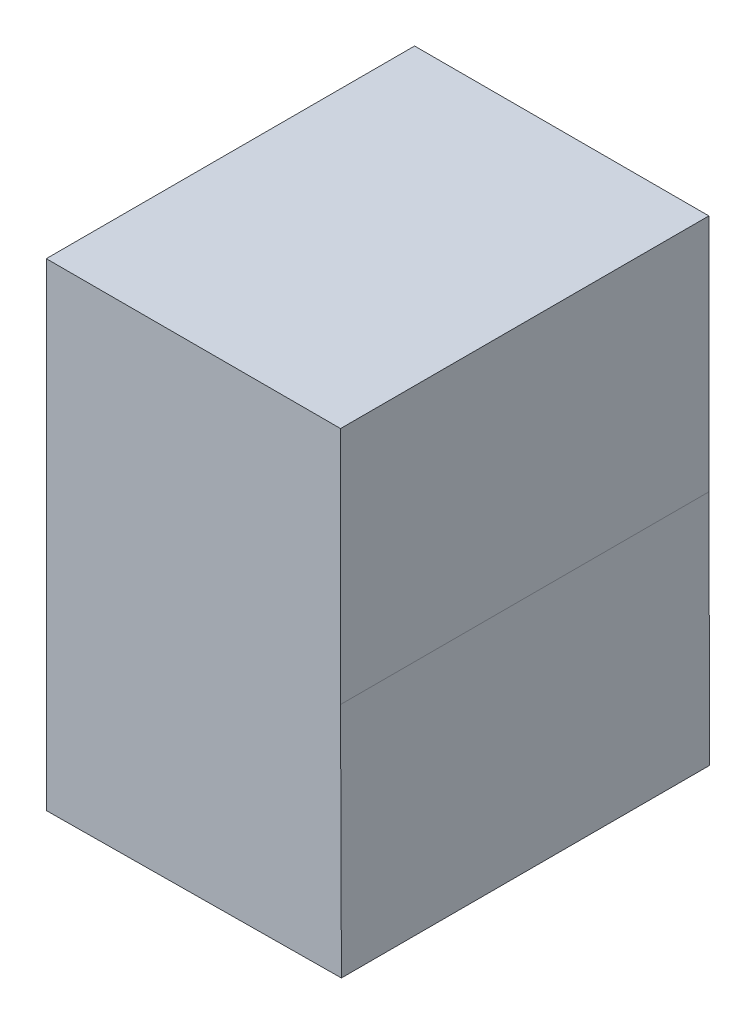
ISO-10303-21;
HEADER;
FILE_DESCRIPTION(('STEP AP214'),'2;1');
FILE_NAME('part.step','',(''),(''),'','','');
FILE_SCHEMA(('AUTOMOTIVE_DESIGN { 1 0 10303 214 1 1 1 1 }'));
ENDSEC;
DATA;
#1=APPLICATION_CONTEXT('core data for automotive mechanical design processes');
#2=APPLICATION_PROTOCOL_DEFINITION('international standard','automotive_design',2000,#1);
#3=PRODUCT_CONTEXT('',#1,'mechanical');
#4=PRODUCT('Part','Part','',(#3));
#5=PRODUCT_RELATED_PRODUCT_CATEGORY('part','',(#4));
#6=PRODUCT_DEFINITION_FORMATION('','',#4);
#7=PRODUCT_DEFINITION_CONTEXT('part definition',#1,'design');
#8=PRODUCT_DEFINITION('design','',#6,#7);
#9=PRODUCT_DEFINITION_SHAPE('','',#8);
#10=(LENGTH_UNIT() NAMED_UNIT(*) SI_UNIT(.MILLI.,.METRE.));
#11=(NAMED_UNIT(*) PLANE_ANGLE_UNIT() SI_UNIT($,.RADIAN.));
#12=(NAMED_UNIT(*) SI_UNIT($,.STERADIAN.) SOLID_ANGLE_UNIT());
#13=UNCERTAINTY_MEASURE_WITH_UNIT(LENGTH_MEASURE(1.E-05),#10,'distance_accuracy_value','');
#14=(GEOMETRIC_REPRESENTATION_CONTEXT(3) GLOBAL_UNCERTAINTY_ASSIGNED_CONTEXT((#13)) GLOBAL_UNIT_ASSIGNED_CONTEXT((#10,
#11,#12)) REPRESENTATION_CONTEXT('',''));
#15=CARTESIAN_POINT('',(0.,0.,0.));
#16=DIRECTION('',(0.,0.,1.));
#17=DIRECTION('',(1.,0.,0.));
#18=AXIS2_PLACEMENT_3D('',#15,#16,#17);
#19=CARTESIAN_POINT('',(4.3815,0.,0.));
#20=DIRECTION('',(-1.,0.,0.));
#21=DIRECTION('',(0.,0.,1.));
#22=AXIS2_PLACEMENT_3D('',#19,#20,#21);
#23=PLANE('',#22);
#24=DIRECTION('',(0.,0.,-1.));
#25=VECTOR('',#24,1.);
#26=CARTESIAN_POINT('',(4.3815,7.1374,0.));
#27=LINE('',#26,#25);
#28=CARTESIAN_POINT('',(4.3815,7.1374,0.));
#29=VERTEX_POINT('',#28);
#30=CARTESIAN_POINT('',(4.3815,7.1374,11.00000086));
#31=VERTEX_POINT('',#30);
#32=EDGE_CURVE('E65',#29,#31,#27,.F.);
#33=ORIENTED_EDGE('',*,*,#32,.T.);
#34=DIRECTION('',(0.,1.,0.));
#35=VECTOR('',#34,1.);
#36=CARTESIAN_POINT('',(4.3815,7.1374,11.00000086));
#37=LINE('',#36,#35);
#38=CARTESIAN_POINT('',(4.38149999999994,2.96037319534989E-11,11.00000086));
#39=VERTEX_POINT('',#38);
#40=EDGE_CURVE('E67',#31,#39,#37,.F.);
#41=ORIENTED_EDGE('',*,*,#40,.T.);
#42=DIRECTION('',(0.,0.,1.));
#43=VECTOR('',#42,1.);
#44=CARTESIAN_POINT('',(4.38149999999996,0.,0.));
#45=LINE('',#44,#43);
#46=CARTESIAN_POINT('',(4.38149999999994,2.96042740545852E-11,0.));
#47=VERTEX_POINT('',#46);
#48=EDGE_CURVE('E20',#39,#47,#45,.F.);
#49=ORIENTED_EDGE('',*,*,#48,.T.);
#50=DIRECTION('',(0.,1.,0.));
#51=VECTOR('',#50,1.);
#52=CARTESIAN_POINT('',(4.3815,7.1374,0.));
#53=LINE('',#52,#51);
#54=EDGE_CURVE('E68',#29,#47,#53,.F.);
#55=ORIENTED_EDGE('',*,*,#54,.F.);
#56=EDGE_LOOP('',(#33,#41,#49,#55));
#57=FACE_BOUND('',#56,.T.);
#58=ADVANCED_FACE('F17',(#57),#23,.F.);
#59=CARTESIAN_POINT('',(4.4069,-7.0612,0.));
#60=DIRECTION('',(-0.999993530418355,-0.00359709903028728,0.));
#61=DIRECTION('',(0.00359709903028728,-0.999993530418355,0.));
#62=AXIS2_PLACEMENT_3D('',#59,#60,#61);
#63=PLANE('',#62);
#64=ORIENTED_EDGE('',*,*,#48,.F.);
#65=DIRECTION('',(0.00359709903028186,-0.999993530418355,0.));
#66=VECTOR('',#65,1.);
#67=CARTESIAN_POINT('',(4.3815,0.,11.00000086));
#68=LINE('',#67,#66);
#69=CARTESIAN_POINT('',(4.4069,-7.06119999999999,11.00000086));
#70=VERTEX_POINT('',#69);
#71=EDGE_CURVE('E79',#39,#70,#68,.T.);
#72=ORIENTED_EDGE('',*,*,#71,.T.);
#73=DIRECTION('',(0.,0.,1.));
#74=VECTOR('',#73,1.);
#75=CARTESIAN_POINT('',(4.4069,-7.06119999999995,0.));
#76=LINE('',#75,#74);
#77=CARTESIAN_POINT('',(4.4069,-7.06119999999999,0.));
#78=VERTEX_POINT('',#77);
#79=EDGE_CURVE('E89',#70,#78,#76,.F.);
#80=ORIENTED_EDGE('',*,*,#79,.T.);
#81=DIRECTION('',(0.00359709903028186,-0.999993530418355,0.));
#82=VECTOR('',#81,1.);
#83=CARTESIAN_POINT('',(4.3815,0.,0.));
#84=LINE('',#83,#82);
#85=EDGE_CURVE('E95',#47,#78,#84,.T.);
#86=ORIENTED_EDGE('',*,*,#85,.F.);
#87=EDGE_LOOP('',(#64,#72,#80,#86));
#88=FACE_BOUND('',#87,.T.);
#89=ADVANCED_FACE('F109',(#88),#63,.F.);
#90=CARTESIAN_POINT('',(4.3815,7.1374,0.));
#91=DIRECTION('',(0.,-1.,0.));
#92=DIRECTION('',(0.,0.,-1.));
#93=AXIS2_PLACEMENT_3D('',#90,#91,#92);
#94=PLANE('',#93);
#95=DIRECTION('',(0.,0.,-1.));
#96=VECTOR('',#95,1.);
#97=CARTESIAN_POINT('',(-4.4069,7.1374,0.));
#98=LINE('',#97,#96);
#99=CARTESIAN_POINT('',(-4.4069,7.1374,0.));
#100=VERTEX_POINT('',#99);
#101=CARTESIAN_POINT('',(-4.4069,7.1374,11.00000086));
#102=VERTEX_POINT('',#101);
#103=EDGE_CURVE('E83',#100,#102,#98,.F.);
#104=ORIENTED_EDGE('',*,*,#103,.T.);
#105=DIRECTION('',(-1.,0.,0.));
#106=VECTOR('',#105,1.);
#107=CARTESIAN_POINT('',(-4.4069,7.1374,11.00000086));
#108=LINE('',#107,#106);
#109=EDGE_CURVE('E73',#102,#31,#108,.F.);
#110=ORIENTED_EDGE('',*,*,#109,.T.);
#111=ORIENTED_EDGE('',*,*,#32,.F.);
#112=DIRECTION('',(-1.,0.,0.));
#113=VECTOR('',#112,1.);
#114=CARTESIAN_POINT('',(-4.4069,7.1374,0.));
#115=LINE('',#114,#113);
#116=EDGE_CURVE('E92',#100,#29,#115,.F.);
#117=ORIENTED_EDGE('',*,*,#116,.F.);
#118=EDGE_LOOP('',(#104,#110,#111,#117));
#119=FACE_BOUND('',#118,.T.);
#120=ADVANCED_FACE('F82',(#119),#94,.F.);
#121=CARTESIAN_POINT('',(-4.4069,7.1374,11.00000086));
#122=DIRECTION('',(0.,0.,-1.));
#123=DIRECTION('',(-1.,0.,0.));
#124=AXIS2_PLACEMENT_3D('',#121,#122,#123);
#125=PLANE('',#124);
#126=DIRECTION('',(-0.999962629473291,-0.00864521005308851,0.));
#127=VECTOR('',#126,1.);
#128=CARTESIAN_POINT('',(-4.4069,-7.1374,11.00000086));
#129=LINE('',#128,#127);
#130=CARTESIAN_POINT('',(-4.4069,-7.1374,11.00000086));
#131=VERTEX_POINT('',#130);
#132=EDGE_CURVE('E87',#131,#70,#129,.F.);
#133=ORIENTED_EDGE('',*,*,#132,.T.);
#134=ORIENTED_EDGE('',*,*,#71,.F.);
#135=ORIENTED_EDGE('',*,*,#40,.F.);
#136=ORIENTED_EDGE('',*,*,#109,.F.);
#137=DIRECTION('',(0.,1.,0.));
#138=VECTOR('',#137,1.);
#139=CARTESIAN_POINT('',(-4.4069,7.1374,11.00000086));
#140=LINE('',#139,#138);
#141=EDGE_CURVE('E99',#102,#131,#140,.F.);
#142=ORIENTED_EDGE('',*,*,#141,.T.);
#143=EDGE_LOOP('',(#133,#134,#135,#136,#142));
#144=FACE_BOUND('',#143,.T.);
#145=ADVANCED_FACE('F76',(#144),#125,.F.);
#146=CARTESIAN_POINT('',(-4.4069,-7.1374,0.));
#147=DIRECTION('',(-0.00864521005308851,0.999962629473291,0.));
#148=DIRECTION('',(-0.999962629473291,-0.00864521005308851,0.));
#149=AXIS2_PLACEMENT_3D('',#146,#147,#148);
#150=PLANE('',#149);
#151=ORIENTED_EDGE('',*,*,#79,.F.);
#152=ORIENTED_EDGE('',*,*,#132,.F.);
#153=DIRECTION('',(0.,0.,-1.));
#154=VECTOR('',#153,1.);
#155=CARTESIAN_POINT('',(-4.4069,-7.1374,0.));
#156=LINE('',#155,#154);
#157=CARTESIAN_POINT('',(-4.4069,-7.1374,0.));
#158=VERTEX_POINT('',#157);
#159=EDGE_CURVE('E26',#131,#158,#156,.T.);
#160=ORIENTED_EDGE('',*,*,#159,.T.);
#161=DIRECTION('',(-0.999962629473291,-0.00864521005308323,0.));
#162=VECTOR('',#161,1.);
#163=CARTESIAN_POINT('',(4.4069,-7.0612,0.));
#164=LINE('',#163,#162);
#165=EDGE_CURVE('E34',#78,#158,#164,.T.);
#166=ORIENTED_EDGE('',*,*,#165,.F.);
#167=EDGE_LOOP('',(#151,#152,#160,#166));
#168=FACE_BOUND('',#167,.T.);
#169=ADVANCED_FACE('F105',(#168),#150,.F.);
#170=CARTESIAN_POINT('',(-4.4069,7.1374,0.));
#171=DIRECTION('',(0.,0.,-1.));
#172=DIRECTION('',(-1.,0.,0.));
#173=AXIS2_PLACEMENT_3D('',#170,#171,#172);
#174=PLANE('',#173);
#175=ORIENTED_EDGE('',*,*,#165,.T.);
#176=DIRECTION('',(0.,1.,0.));
#177=VECTOR('',#176,1.);
#178=CARTESIAN_POINT('',(-4.4069,7.1374,0.));
#179=LINE('',#178,#177);
#180=EDGE_CURVE('E11',#158,#100,#179,.T.);
#181=ORIENTED_EDGE('',*,*,#180,.T.);
#182=ORIENTED_EDGE('',*,*,#116,.T.);
#183=ORIENTED_EDGE('',*,*,#54,.T.);
#184=ORIENTED_EDGE('',*,*,#85,.T.);
#185=EDGE_LOOP('',(#175,#181,#182,#183,#184));
#186=FACE_BOUND('',#185,.T.);
#187=ADVANCED_FACE('F108',(#186),#174,.T.);
#188=CARTESIAN_POINT('',(-4.4069,7.1374,0.));
#189=DIRECTION('',(1.,0.,0.));
#190=DIRECTION('',(0.,0.,-1.));
#191=AXIS2_PLACEMENT_3D('',#188,#189,#190);
#192=PLANE('',#191);
#193=ORIENTED_EDGE('',*,*,#159,.F.);
#194=ORIENTED_EDGE('',*,*,#141,.F.);
#195=ORIENTED_EDGE('',*,*,#103,.F.);
#196=ORIENTED_EDGE('',*,*,#180,.F.);
#197=EDGE_LOOP('',(#193,#194,#195,#196));
#198=FACE_BOUND('',#197,.T.);
#199=ADVANCED_FACE('F107',(#198),#192,.F.);
#200=CLOSED_SHELL('',(#58,#89,#120,#145,#169,#187,#199));
#201=MANIFOLD_SOLID_BREP('B1',#200);
#202=ADVANCED_BREP_SHAPE_REPRESENTATION('',(#18,#201),#14);
#203=SHAPE_DEFINITION_REPRESENTATION(#9,#202);
ENDSEC;
END-ISO-10303-21;
